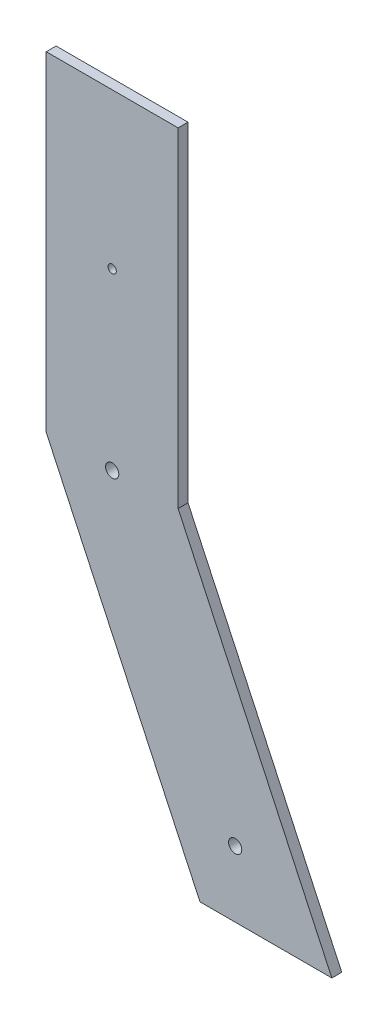
ISO-10303-21;
HEADER;
FILE_DESCRIPTION(('STEP AP214'),'2;1');
FILE_NAME('part.step','',(''),(''),'','','');
FILE_SCHEMA(('AUTOMOTIVE_DESIGN { 1 0 10303 214 1 1 1 1 }'));
ENDSEC;
DATA;
#1=APPLICATION_CONTEXT('core data for automotive mechanical design processes');
#2=APPLICATION_PROTOCOL_DEFINITION('international standard','automotive_design',2000,#1);
#3=PRODUCT_CONTEXT('',#1,'mechanical');
#4=PRODUCT('Part','Part','',(#3));
#5=PRODUCT_RELATED_PRODUCT_CATEGORY('part','',(#4));
#6=PRODUCT_DEFINITION_FORMATION('','',#4);
#7=PRODUCT_DEFINITION_CONTEXT('part definition',#1,'design');
#8=PRODUCT_DEFINITION('design','',#6,#7);
#9=PRODUCT_DEFINITION_SHAPE('','',#8);
#10=(LENGTH_UNIT() NAMED_UNIT(*) SI_UNIT(.MILLI.,.METRE.));
#11=(NAMED_UNIT(*) PLANE_ANGLE_UNIT() SI_UNIT($,.RADIAN.));
#12=(NAMED_UNIT(*) SI_UNIT($,.STERADIAN.) SOLID_ANGLE_UNIT());
#13=UNCERTAINTY_MEASURE_WITH_UNIT(LENGTH_MEASURE(1.E-05),#10,'distance_accuracy_value','');
#14=(GEOMETRIC_REPRESENTATION_CONTEXT(3) GLOBAL_UNCERTAINTY_ASSIGNED_CONTEXT((#13)) GLOBAL_UNIT_ASSIGNED_CONTEXT((#10,
#11,#12)) REPRESENTATION_CONTEXT('',''));
#15=CARTESIAN_POINT('',(0.,0.,0.));
#16=DIRECTION('',(0.,0.,1.));
#17=DIRECTION('',(1.,0.,0.));
#18=AXIS2_PLACEMENT_3D('',#15,#16,#17);
#19=CARTESIAN_POINT('',(0.,0.,3.));
#20=DIRECTION('',(0.,0.,-1.));
#21=DIRECTION('',(-1.,0.,0.));
#22=AXIS2_PLACEMENT_3D('',#19,#20,#21);
#23=PLANE('',#22);
#24=DIRECTION('',(-0.422618261740704,0.906307787036648,0.));
#25=VECTOR('',#24,1.);
#26=CARTESIAN_POINT('',(-46.6307658155005,100.,3.));
#27=LINE('',#26,#25);
#28=CARTESIAN_POINT('',(0.,0.,3.));
#29=VERTEX_POINT('',#28);
#30=CARTESIAN_POINT('',(-46.6307658155005,100.,3.));
#31=VERTEX_POINT('',#30);
#32=EDGE_CURVE('E150',#29,#31,#27,.T.);
#33=ORIENTED_EDGE('',*,*,#32,.T.);
#34=DIRECTION('',(0.,1.,0.));
#35=VECTOR('',#34,1.);
#36=CARTESIAN_POINT('',(-46.6307658155005,200.,3.));
#37=LINE('',#36,#35);
#38=CARTESIAN_POINT('',(-46.6307658155005,200.,3.));
#39=VERTEX_POINT('',#38);
#40=EDGE_CURVE('E98',#31,#39,#37,.T.);
#41=ORIENTED_EDGE('',*,*,#40,.T.);
#42=DIRECTION('',(-1.,0.,0.));
#43=VECTOR('',#42,1.);
#44=CARTESIAN_POINT('',(-86.6307658155005,200.,3.));
#45=LINE('',#44,#43);
#46=CARTESIAN_POINT('',(-86.6307658155005,200.,3.));
#47=VERTEX_POINT('',#46);
#48=EDGE_CURVE('E111',#39,#47,#45,.T.);
#49=ORIENTED_EDGE('',*,*,#48,.T.);
#50=DIRECTION('',(0.,-1.,0.));
#51=VECTOR('',#50,1.);
#52=CARTESIAN_POINT('',(-86.6307658155005,100.,3.));
#53=LINE('',#52,#51);
#54=CARTESIAN_POINT('',(-86.6307658155005,100.,3.));
#55=VERTEX_POINT('',#54);
#56=EDGE_CURVE('E105',#47,#55,#53,.T.);
#57=ORIENTED_EDGE('',*,*,#56,.T.);
#58=DIRECTION('',(0.422618261740704,-0.906307787036648,0.));
#59=VECTOR('',#58,1.);
#60=CARTESIAN_POINT('',(-86.6307658155005,100.,3.));
#61=LINE('',#60,#59);
#62=CARTESIAN_POINT('',(-40.,0.,3.));
#63=VERTEX_POINT('',#62);
#64=EDGE_CURVE('E109',#55,#63,#61,.T.);
#65=ORIENTED_EDGE('',*,*,#64,.T.);
#66=DIRECTION('',(1.,0.,0.));
#67=VECTOR('',#66,1.);
#68=CARTESIAN_POINT('',(0.,0.,3.));
#69=LINE('',#68,#67);
#70=EDGE_CURVE('E61',#63,#29,#69,.T.);
#71=ORIENTED_EDGE('',*,*,#70,.T.);
#72=EDGE_LOOP('',(#33,#41,#49,#57,#65,#71));
#73=FACE_BOUND('',#72,.T.);
#74=CARTESIAN_POINT('',(-29.3261531631001,20.,3.));
#75=DIRECTION('',(0.,0.,1.));
#76=DIRECTION('',(1.,0.,0.));
#77=AXIS2_PLACEMENT_3D('',#74,#75,#76);
#78=CIRCLE('',#77,2.);
#79=CARTESIAN_POINT('',(-27.3261531631001,20.,3.));
#80=VERTEX_POINT('',#79);
#81=EDGE_CURVE('E138',#80,#80,#78,.T.);
#82=ORIENTED_EDGE('',*,*,#81,.F.);
#83=EDGE_LOOP('',(#82));
#84=FACE_BOUND('',#83,.T.);
#85=CARTESIAN_POINT('',(-66.6307658155005,152.96,3.));
#86=DIRECTION('',(0.,0.,1.));
#87=DIRECTION('',(1.,0.,0.));
#88=AXIS2_PLACEMENT_3D('',#85,#86,#87);
#89=CIRCLE('',#88,1.25);
#90=CARTESIAN_POINT('',(-65.3807658155005,152.96,3.));
#91=VERTEX_POINT('',#90);
#92=EDGE_CURVE('E210',#91,#91,#89,.T.);
#93=ORIENTED_EDGE('',*,*,#92,.F.);
#94=EDGE_LOOP('',(#93));
#95=FACE_BOUND('',#94,.T.);
#96=CARTESIAN_POINT('',(-66.6307658155005,100.,3.));
#97=DIRECTION('',(0.,0.,1.));
#98=DIRECTION('',(1.,0.,0.));
#99=AXIS2_PLACEMENT_3D('',#96,#97,#98);
#100=CIRCLE('',#99,2.);
#101=CARTESIAN_POINT('',(-64.6307658155005,100.,3.));
#102=VERTEX_POINT('',#101);
#103=EDGE_CURVE('E199',#102,#102,#100,.T.);
#104=ORIENTED_EDGE('',*,*,#103,.F.);
#105=EDGE_LOOP('',(#104));
#106=FACE_BOUND('',#105,.T.);
#107=ADVANCED_FACE('F43',(#73,#84,#95,#106),#23,.F.);
#108=CARTESIAN_POINT('',(0.,0.,0.));
#109=DIRECTION('',(0.,0.,-1.));
#110=DIRECTION('',(-1.,0.,0.));
#111=AXIS2_PLACEMENT_3D('',#108,#109,#110);
#112=PLANE('',#111);
#113=CARTESIAN_POINT('',(-66.6307658155005,152.96,0.));
#114=DIRECTION('',(0.,0.,1.));
#115=DIRECTION('',(1.,0.,0.));
#116=AXIS2_PLACEMENT_3D('',#113,#114,#115);
#117=CIRCLE('',#116,1.25);
#118=CARTESIAN_POINT('',(-65.3807658155005,152.96,0.));
#119=VERTEX_POINT('',#118);
#120=EDGE_CURVE('E207',#119,#119,#117,.T.);
#121=ORIENTED_EDGE('',*,*,#120,.T.);
#122=EDGE_LOOP('',(#121));
#123=FACE_BOUND('',#122,.T.);
#124=DIRECTION('',(-0.422618261740704,0.906307787036648,0.));
#125=VECTOR('',#124,1.);
#126=CARTESIAN_POINT('',(-46.6307658155005,100.,0.));
#127=LINE('',#126,#125);
#128=CARTESIAN_POINT('',(0.,0.,0.));
#129=VERTEX_POINT('',#128);
#130=CARTESIAN_POINT('',(-46.6307658155005,100.,0.));
#131=VERTEX_POINT('',#130);
#132=EDGE_CURVE('E133',#129,#131,#127,.T.);
#133=ORIENTED_EDGE('',*,*,#132,.F.);
#134=DIRECTION('',(1.,0.,0.));
#135=VECTOR('',#134,1.);
#136=CARTESIAN_POINT('',(0.,0.,0.));
#137=LINE('',#136,#135);
#138=CARTESIAN_POINT('',(-40.,0.,0.));
#139=VERTEX_POINT('',#138);
#140=EDGE_CURVE('E90',#139,#129,#137,.T.);
#141=ORIENTED_EDGE('',*,*,#140,.F.);
#142=DIRECTION('',(0.422618261740704,-0.906307787036648,0.));
#143=VECTOR('',#142,1.);
#144=CARTESIAN_POINT('',(-86.6307658155005,100.,0.));
#145=LINE('',#144,#143);
#146=CARTESIAN_POINT('',(-86.6307658155005,100.,0.));
#147=VERTEX_POINT('',#146);
#148=EDGE_CURVE('E84',#147,#139,#145,.T.);
#149=ORIENTED_EDGE('',*,*,#148,.F.);
#150=DIRECTION('',(0.,-1.,0.));
#151=VECTOR('',#150,1.);
#152=CARTESIAN_POINT('',(-86.6307658155005,100.,0.));
#153=LINE('',#152,#151);
#154=CARTESIAN_POINT('',(-86.6307658155005,200.,0.));
#155=VERTEX_POINT('',#154);
#156=EDGE_CURVE('E120',#155,#147,#153,.T.);
#157=ORIENTED_EDGE('',*,*,#156,.F.);
#158=DIRECTION('',(-1.,0.,0.));
#159=VECTOR('',#158,1.);
#160=CARTESIAN_POINT('',(-86.6307658155005,200.,0.));
#161=LINE('',#160,#159);
#162=CARTESIAN_POINT('',(-46.6307658155005,200.,0.));
#163=VERTEX_POINT('',#162);
#164=EDGE_CURVE('E141',#163,#155,#161,.T.);
#165=ORIENTED_EDGE('',*,*,#164,.F.);
#166=DIRECTION('',(0.,1.,0.));
#167=VECTOR('',#166,1.);
#168=CARTESIAN_POINT('',(-46.6307658155005,200.,0.));
#169=LINE('',#168,#167);
#170=EDGE_CURVE('E137',#131,#163,#169,.T.);
#171=ORIENTED_EDGE('',*,*,#170,.F.);
#172=EDGE_LOOP('',(#133,#141,#149,#157,#165,#171));
#173=FACE_BOUND('',#172,.T.);
#174=CARTESIAN_POINT('',(-29.3261531631001,20.,0.));
#175=DIRECTION('',(0.,0.,1.));
#176=DIRECTION('',(1.,0.,0.));
#177=AXIS2_PLACEMENT_3D('',#174,#175,#176);
#178=CIRCLE('',#177,2.);
#179=CARTESIAN_POINT('',(-27.3261531631001,20.,0.));
#180=VERTEX_POINT('',#179);
#181=EDGE_CURVE('E214',#180,#180,#178,.T.);
#182=ORIENTED_EDGE('',*,*,#181,.T.);
#183=EDGE_LOOP('',(#182));
#184=FACE_BOUND('',#183,.T.);
#185=CARTESIAN_POINT('',(-66.6307658155005,100.,0.));
#186=DIRECTION('',(0.,0.,1.));
#187=DIRECTION('',(1.,0.,0.));
#188=AXIS2_PLACEMENT_3D('',#185,#186,#187);
#189=CIRCLE('',#188,2.);
#190=CARTESIAN_POINT('',(-64.6307658155005,100.,0.));
#191=VERTEX_POINT('',#190);
#192=EDGE_CURVE('E202',#191,#191,#189,.T.);
#193=ORIENTED_EDGE('',*,*,#192,.T.);
#194=EDGE_LOOP('',(#193));
#195=FACE_BOUND('',#194,.T.);
#196=ADVANCED_FACE('F163',(#123,#173,#184,#195),#112,.T.);
#197=CARTESIAN_POINT('',(-46.6307658155005,100.,3.));
#198=DIRECTION('',(-0.906307787036648,-0.422618261740704,0.));
#199=DIRECTION('',(0.422618261740704,-0.906307787036648,0.));
#200=AXIS2_PLACEMENT_3D('',#197,#198,#199);
#201=PLANE('',#200);
#202=ORIENTED_EDGE('',*,*,#132,.T.);
#203=DIRECTION('',(0.,0.,-1.));
#204=VECTOR('',#203,1.);
#205=CARTESIAN_POINT('',(-46.6307658155005,100.,3.));
#206=LINE('',#205,#204);
#207=EDGE_CURVE('E11',#31,#131,#206,.T.);
#208=ORIENTED_EDGE('',*,*,#207,.F.);
#209=ORIENTED_EDGE('',*,*,#32,.F.);
#210=DIRECTION('',(0.,0.,-1.));
#211=VECTOR('',#210,1.);
#212=CARTESIAN_POINT('',(0.,0.,3.));
#213=LINE('',#212,#211);
#214=EDGE_CURVE('E129',#29,#129,#213,.T.);
#215=ORIENTED_EDGE('',*,*,#214,.T.);
#216=EDGE_LOOP('',(#202,#208,#209,#215));
#217=FACE_BOUND('',#216,.T.);
#218=ADVANCED_FACE('F45',(#217),#201,.F.);
#219=CARTESIAN_POINT('',(-46.6307658155005,200.,3.));
#220=DIRECTION('',(-1.,0.,0.));
#221=DIRECTION('',(0.,-1.,0.));
#222=AXIS2_PLACEMENT_3D('',#219,#220,#221);
#223=PLANE('',#222);
#224=ORIENTED_EDGE('',*,*,#170,.T.);
#225=DIRECTION('',(0.,0.,-1.));
#226=VECTOR('',#225,1.);
#227=CARTESIAN_POINT('',(-46.6307658155005,200.,3.));
#228=LINE('',#227,#226);
#229=EDGE_CURVE('E53',#39,#163,#228,.T.);
#230=ORIENTED_EDGE('',*,*,#229,.F.);
#231=ORIENTED_EDGE('',*,*,#40,.F.);
#232=ORIENTED_EDGE('',*,*,#207,.T.);
#233=EDGE_LOOP('',(#224,#230,#231,#232));
#234=FACE_BOUND('',#233,.T.);
#235=ADVANCED_FACE('F275',(#234),#223,.F.);
#236=CARTESIAN_POINT('',(-86.6307658155005,200.,3.));
#237=DIRECTION('',(0.,-1.,0.));
#238=DIRECTION('',(0.,0.,-1.));
#239=AXIS2_PLACEMENT_3D('',#236,#237,#238);
#240=PLANE('',#239);
#241=ORIENTED_EDGE('',*,*,#164,.T.);
#242=DIRECTION('',(0.,0.,-1.));
#243=VECTOR('',#242,1.);
#244=CARTESIAN_POINT('',(-86.6307658155005,200.,3.));
#245=LINE('',#244,#243);
#246=EDGE_CURVE('E122',#47,#155,#245,.T.);
#247=ORIENTED_EDGE('',*,*,#246,.F.);
#248=ORIENTED_EDGE('',*,*,#48,.F.);
#249=ORIENTED_EDGE('',*,*,#229,.T.);
#250=EDGE_LOOP('',(#241,#247,#248,#249));
#251=FACE_BOUND('',#250,.T.);
#252=ADVANCED_FACE('F160',(#251),#240,.F.);
#253=CARTESIAN_POINT('',(-86.6307658155005,100.,3.));
#254=DIRECTION('',(1.,0.,0.));
#255=DIRECTION('',(0.,1.,0.));
#256=AXIS2_PLACEMENT_3D('',#253,#254,#255);
#257=PLANE('',#256);
#258=ORIENTED_EDGE('',*,*,#156,.T.);
#259=DIRECTION('',(0.,0.,-1.));
#260=VECTOR('',#259,1.);
#261=CARTESIAN_POINT('',(-86.6307658155005,100.,3.));
#262=LINE('',#261,#260);
#263=EDGE_CURVE('E117',#55,#147,#262,.T.);
#264=ORIENTED_EDGE('',*,*,#263,.F.);
#265=ORIENTED_EDGE('',*,*,#56,.F.);
#266=ORIENTED_EDGE('',*,*,#246,.T.);
#267=EDGE_LOOP('',(#258,#264,#265,#266));
#268=FACE_BOUND('',#267,.T.);
#269=ADVANCED_FACE('F118',(#268),#257,.F.);
#270=CARTESIAN_POINT('',(-86.6307658155005,100.,3.));
#271=DIRECTION('',(0.906307787036648,0.422618261740704,0.));
#272=DIRECTION('',(-0.422618261740704,0.906307787036648,0.));
#273=AXIS2_PLACEMENT_3D('',#270,#271,#272);
#274=PLANE('',#273);
#275=ORIENTED_EDGE('',*,*,#148,.T.);
#276=DIRECTION('',(0.,0.,-1.));
#277=VECTOR('',#276,1.);
#278=CARTESIAN_POINT('',(-40.,0.,3.));
#279=LINE('',#278,#277);
#280=EDGE_CURVE('E123',#63,#139,#279,.T.);
#281=ORIENTED_EDGE('',*,*,#280,.F.);
#282=ORIENTED_EDGE('',*,*,#64,.F.);
#283=ORIENTED_EDGE('',*,*,#263,.T.);
#284=EDGE_LOOP('',(#275,#281,#282,#283));
#285=FACE_BOUND('',#284,.T.);
#286=ADVANCED_FACE('F125',(#285),#274,.F.);
#287=CARTESIAN_POINT('',(0.,0.,3.));
#288=DIRECTION('',(0.,1.,0.));
#289=DIRECTION('',(-1.,0.,0.));
#290=AXIS2_PLACEMENT_3D('',#287,#288,#289);
#291=PLANE('',#290);
#292=ORIENTED_EDGE('',*,*,#140,.T.);
#293=ORIENTED_EDGE('',*,*,#214,.F.);
#294=ORIENTED_EDGE('',*,*,#70,.F.);
#295=ORIENTED_EDGE('',*,*,#280,.T.);
#296=EDGE_LOOP('',(#292,#293,#294,#295));
#297=FACE_BOUND('',#296,.T.);
#298=ADVANCED_FACE('F168',(#297),#291,.F.);
#299=CARTESIAN_POINT('',(-29.3261531631001,20.,3.));
#300=DIRECTION('',(0.,0.,-1.));
#301=DIRECTION('',(-1.,0.,0.));
#302=AXIS2_PLACEMENT_3D('',#299,#300,#301);
#303=CYLINDRICAL_SURFACE('',#302,2.);
#304=ORIENTED_EDGE('',*,*,#81,.T.);
#305=EDGE_LOOP('',(#304));
#306=FACE_BOUND('',#305,.T.);
#307=ORIENTED_EDGE('',*,*,#181,.F.);
#308=EDGE_LOOP('',(#307));
#309=FACE_BOUND('',#308,.T.);
#310=ADVANCED_FACE('F170',(#306,#309),#303,.F.);
#311=CARTESIAN_POINT('',(-66.6307658155005,152.96,3.));
#312=DIRECTION('',(0.,0.,-1.));
#313=DIRECTION('',(-1.,0.,0.));
#314=AXIS2_PLACEMENT_3D('',#311,#312,#313);
#315=CYLINDRICAL_SURFACE('',#314,1.25);
#316=ORIENTED_EDGE('',*,*,#92,.T.);
#317=EDGE_LOOP('',(#316));
#318=FACE_BOUND('',#317,.T.);
#319=ORIENTED_EDGE('',*,*,#120,.F.);
#320=EDGE_LOOP('',(#319));
#321=FACE_BOUND('',#320,.T.);
#322=ADVANCED_FACE('F176',(#318,#321),#315,.F.);
#323=CARTESIAN_POINT('',(-66.6307658155005,100.,3.));
#324=DIRECTION('',(0.,0.,-1.));
#325=DIRECTION('',(-1.,0.,0.));
#326=AXIS2_PLACEMENT_3D('',#323,#324,#325);
#327=CYLINDRICAL_SURFACE('',#326,2.);
#328=ORIENTED_EDGE('',*,*,#103,.T.);
#329=EDGE_LOOP('',(#328));
#330=FACE_BOUND('',#329,.T.);
#331=ORIENTED_EDGE('',*,*,#192,.F.);
#332=EDGE_LOOP('',(#331));
#333=FACE_BOUND('',#332,.T.);
#334=ADVANCED_FACE('F190',(#330,#333),#327,.F.);
#335=CLOSED_SHELL('',(#107,#196,#218,#235,#252,#269,#286,#298,#310,#322,#334));
#336=MANIFOLD_SOLID_BREP('B2',#335);
#337=ADVANCED_BREP_SHAPE_REPRESENTATION('',(#18,#336),#14);
#338=SHAPE_DEFINITION_REPRESENTATION(#9,#337);
ENDSEC;
END-ISO-10303-21;
